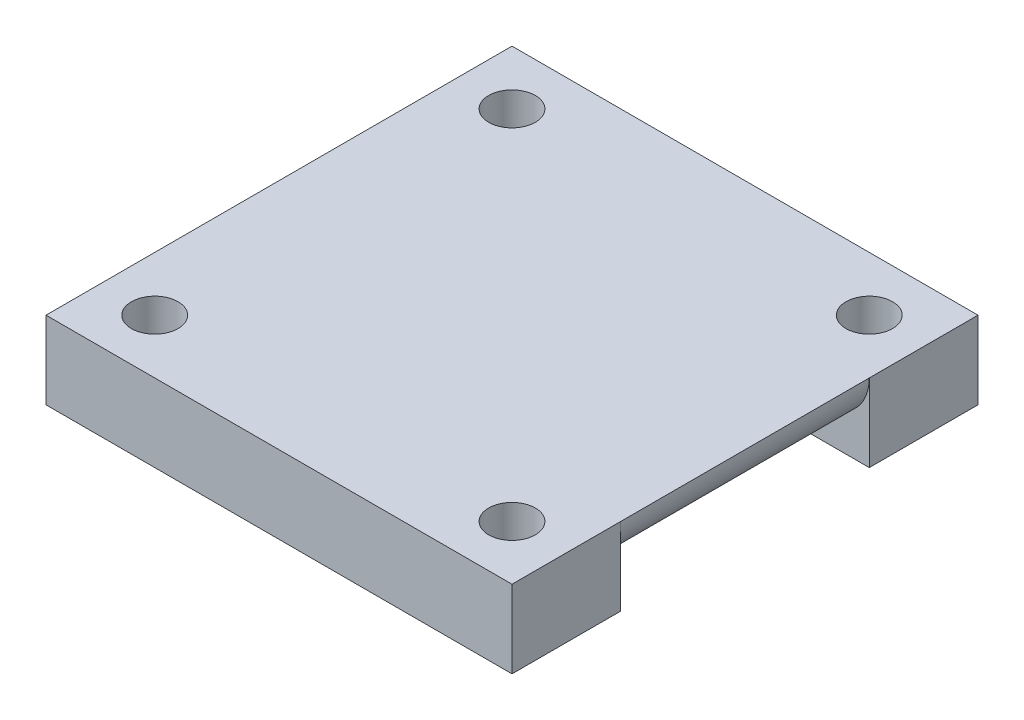
ISO-10303-21;
HEADER;
FILE_DESCRIPTION(('STEP AP214'),'2;1');
FILE_NAME('part.step','',(''),(''),'','','');
FILE_SCHEMA(('AUTOMOTIVE_DESIGN { 1 0 10303 214 1 1 1 1 }'));
ENDSEC;
DATA;
#1=APPLICATION_CONTEXT('core data for automotive mechanical design processes');
#2=APPLICATION_PROTOCOL_DEFINITION('international standard','automotive_design',2000,#1);
#3=PRODUCT_CONTEXT('',#1,'mechanical');
#4=PRODUCT('Part','Part','',(#3));
#5=PRODUCT_RELATED_PRODUCT_CATEGORY('part','',(#4));
#6=PRODUCT_DEFINITION_FORMATION('','',#4);
#7=PRODUCT_DEFINITION_CONTEXT('part definition',#1,'design');
#8=PRODUCT_DEFINITION('design','',#6,#7);
#9=PRODUCT_DEFINITION_SHAPE('','',#8);
#10=(LENGTH_UNIT() NAMED_UNIT(*) SI_UNIT(.MILLI.,.METRE.));
#11=(NAMED_UNIT(*) PLANE_ANGLE_UNIT() SI_UNIT($,.RADIAN.));
#12=(NAMED_UNIT(*) SI_UNIT($,.STERADIAN.) SOLID_ANGLE_UNIT());
#13=UNCERTAINTY_MEASURE_WITH_UNIT(LENGTH_MEASURE(1.E-05),#10,'distance_accuracy_value','');
#14=(GEOMETRIC_REPRESENTATION_CONTEXT(3) GLOBAL_UNCERTAINTY_ASSIGNED_CONTEXT((#13)) GLOBAL_UNIT_ASSIGNED_CONTEXT((#10,
#11,#12)) REPRESENTATION_CONTEXT('',''));
#15=CARTESIAN_POINT('',(0.,0.,0.));
#16=DIRECTION('',(0.,0.,1.));
#17=DIRECTION('',(1.,0.,0.));
#18=AXIS2_PLACEMENT_3D('',#15,#16,#17);
#19=CARTESIAN_POINT('',(15.,5.,0.));
#20=DIRECTION('',(1.,0.,0.));
#21=DIRECTION('',(0.,0.,-1.));
#22=AXIS2_PLACEMENT_3D('',#19,#20,#21);
#23=PLANE('',#22);
#24=DIRECTION('',(0.,-1.,0.));
#25=VECTOR('',#24,1.);
#26=CARTESIAN_POINT('',(15.,2.,8.));
#27=LINE('',#26,#25);
#28=CARTESIAN_POINT('',(15.,5.,8.));
#29=VERTEX_POINT('',#28);
#30=CARTESIAN_POINT('',(15.,0.,8.));
#31=VERTEX_POINT('',#30);
#32=EDGE_CURVE('E62',#29,#31,#27,.T.);
#33=ORIENTED_EDGE('',*,*,#32,.F.);
#34=DIRECTION('',(0.,0.,1.));
#35=VECTOR('',#34,1.);
#36=CARTESIAN_POINT('',(15.,5.,0.));
#37=LINE('',#36,#35);
#38=CARTESIAN_POINT('',(15.,5.,15.));
#39=VERTEX_POINT('',#38);
#40=EDGE_CURVE('E218',#29,#39,#37,.T.);
#41=ORIENTED_EDGE('',*,*,#40,.T.);
#42=DIRECTION('',(0.,-1.,0.));
#43=VECTOR('',#42,1.);
#44=CARTESIAN_POINT('',(15.,5.,15.));
#45=LINE('',#44,#43);
#46=CARTESIAN_POINT('',(15.,0.,15.));
#47=VERTEX_POINT('',#46);
#48=EDGE_CURVE('E188',#39,#47,#45,.T.);
#49=ORIENTED_EDGE('',*,*,#48,.T.);
#50=DIRECTION('',(0.,0.,1.));
#51=VECTOR('',#50,1.);
#52=CARTESIAN_POINT('',(15.,0.,0.));
#53=LINE('',#52,#51);
#54=EDGE_CURVE('E157',#31,#47,#53,.T.);
#55=ORIENTED_EDGE('',*,*,#54,.F.);
#56=EDGE_LOOP('',(#33,#41,#49,#55));
#57=FACE_BOUND('',#56,.T.);
#58=ADVANCED_FACE('F46',(#57),#23,.T.);
#59=CARTESIAN_POINT('',(-15.,5.,0.));
#60=DIRECTION('',(1.,0.,0.));
#61=DIRECTION('',(0.,0.,-1.));
#62=AXIS2_PLACEMENT_3D('',#59,#60,#61);
#63=PLANE('',#62);
#64=DIRECTION('',(0.,0.,1.));
#65=VECTOR('',#64,1.);
#66=CARTESIAN_POINT('',(-15.,5.,0.));
#67=LINE('',#66,#65);
#68=CARTESIAN_POINT('',(-15.,5.,8.));
#69=VERTEX_POINT('',#68);
#70=CARTESIAN_POINT('',(-15.,5.,15.));
#71=VERTEX_POINT('',#70);
#72=EDGE_CURVE('E138',#69,#71,#67,.T.);
#73=ORIENTED_EDGE('',*,*,#72,.F.);
#74=DIRECTION('',(0.,-1.,0.));
#75=VECTOR('',#74,1.);
#76=CARTESIAN_POINT('',(-15.,2.,8.));
#77=LINE('',#76,#75);
#78=CARTESIAN_POINT('',(-15.,0.,8.));
#79=VERTEX_POINT('',#78);
#80=EDGE_CURVE('E125',#69,#79,#77,.T.);
#81=ORIENTED_EDGE('',*,*,#80,.T.);
#82=DIRECTION('',(0.,0.,1.));
#83=VECTOR('',#82,1.);
#84=CARTESIAN_POINT('',(-15.,0.,0.));
#85=LINE('',#84,#83);
#86=CARTESIAN_POINT('',(-15.,0.,15.));
#87=VERTEX_POINT('',#86);
#88=EDGE_CURVE('E136',#79,#87,#85,.T.);
#89=ORIENTED_EDGE('',*,*,#88,.T.);
#90=DIRECTION('',(0.,-1.,0.));
#91=VECTOR('',#90,1.);
#92=CARTESIAN_POINT('',(-15.,5.,15.));
#93=LINE('',#92,#91);
#94=EDGE_CURVE('E192',#71,#87,#93,.T.);
#95=ORIENTED_EDGE('',*,*,#94,.F.);
#96=EDGE_LOOP('',(#73,#81,#89,#95));
#97=FACE_BOUND('',#96,.T.);
#98=ADVANCED_FACE('F134',(#97),#63,.F.);
#99=DIRECTION('',(0.,-1.,0.));
#100=VECTOR('',#99,1.);
#101=CARTESIAN_POINT('',(-15.,2.,-8.));
#102=LINE('',#101,#100);
#103=CARTESIAN_POINT('',(-15.,5.,-8.));
#104=VERTEX_POINT('',#103);
#105=CARTESIAN_POINT('',(-15.,0.,-8.));
#106=VERTEX_POINT('',#105);
#107=EDGE_CURVE('E309',#104,#106,#102,.T.);
#108=ORIENTED_EDGE('',*,*,#107,.F.);
#109=CARTESIAN_POINT('',(-15.,5.,-15.));
#110=VERTEX_POINT('',#109);
#111=EDGE_CURVE('E315',#110,#104,#67,.T.);
#112=ORIENTED_EDGE('',*,*,#111,.F.);
#113=DIRECTION('',(0.,-1.,0.));
#114=VECTOR('',#113,1.);
#115=CARTESIAN_POINT('',(-15.,5.,-15.));
#116=LINE('',#115,#114);
#117=CARTESIAN_POINT('',(-15.,0.,-15.));
#118=VERTEX_POINT('',#117);
#119=EDGE_CURVE('E182',#110,#118,#116,.T.);
#120=ORIENTED_EDGE('',*,*,#119,.T.);
#121=EDGE_CURVE('E147',#118,#106,#85,.T.);
#122=ORIENTED_EDGE('',*,*,#121,.T.);
#123=EDGE_LOOP('',(#108,#112,#120,#122));
#124=FACE_BOUND('',#123,.T.);
#125=ADVANCED_FACE('F278',(#124),#63,.F.);
#126=CARTESIAN_POINT('',(15.,5.,-15.));
#127=VERTEX_POINT('',#126);
#128=CARTESIAN_POINT('',(15.,5.,-8.));
#129=VERTEX_POINT('',#128);
#130=EDGE_CURVE('E230',#127,#129,#37,.T.);
#131=ORIENTED_EDGE('',*,*,#130,.T.);
#132=DIRECTION('',(0.,-1.,0.));
#133=VECTOR('',#132,1.);
#134=CARTESIAN_POINT('',(15.,2.,-8.));
#135=LINE('',#134,#133);
#136=CARTESIAN_POINT('',(15.,0.,-8.));
#137=VERTEX_POINT('',#136);
#138=EDGE_CURVE('E69',#129,#137,#135,.T.);
#139=ORIENTED_EDGE('',*,*,#138,.T.);
#140=CARTESIAN_POINT('',(15.,0.,-15.));
#141=VERTEX_POINT('',#140);
#142=EDGE_CURVE('E158',#141,#137,#53,.T.);
#143=ORIENTED_EDGE('',*,*,#142,.F.);
#144=DIRECTION('',(0.,-1.,0.));
#145=VECTOR('',#144,1.);
#146=CARTESIAN_POINT('',(15.,5.,-15.));
#147=LINE('',#146,#145);
#148=EDGE_CURVE('E185',#127,#141,#147,.T.);
#149=ORIENTED_EDGE('',*,*,#148,.F.);
#150=EDGE_LOOP('',(#131,#139,#143,#149));
#151=FACE_BOUND('',#150,.T.);
#152=ADVANCED_FACE('F267',(#151),#23,.T.);
#153=CARTESIAN_POINT('',(0.,0.,0.));
#154=DIRECTION('',(0.,1.,0.));
#155=DIRECTION('',(0.,0.,1.));
#156=AXIS2_PLACEMENT_3D('',#153,#154,#155);
#157=PLANE('',#156);
#158=CARTESIAN_POINT('',(-11.5,0.,11.5));
#159=DIRECTION('',(0.,1.,0.));
#160=DIRECTION('',(0.,0.,1.));
#161=AXIS2_PLACEMENT_3D('',#158,#159,#160);
#162=CIRCLE('',#161,1.5);
#163=CARTESIAN_POINT('',(-11.5,0.,13.));
#164=VERTEX_POINT('',#163);
#165=EDGE_CURVE('E174',#164,#164,#162,.T.);
#166=ORIENTED_EDGE('',*,*,#165,.T.);
#167=EDGE_LOOP('',(#166));
#168=FACE_BOUND('',#167,.T.);
#169=CARTESIAN_POINT('',(11.5,0.,11.5));
#170=DIRECTION('',(0.,1.,0.));
#171=DIRECTION('',(0.,0.,1.));
#172=AXIS2_PLACEMENT_3D('',#169,#170,#171);
#173=CIRCLE('',#172,1.5);
#174=CARTESIAN_POINT('',(11.5,0.,13.));
#175=VERTEX_POINT('',#174);
#176=EDGE_CURVE('E178',#175,#175,#173,.F.);
#177=ORIENTED_EDGE('',*,*,#176,.F.);
#178=EDGE_LOOP('',(#177));
#179=FACE_BOUND('',#178,.T.);
#180=DIRECTION('',(1.,0.,0.));
#181=VECTOR('',#180,1.);
#182=CARTESIAN_POINT('',(0.,0.,8.));
#183=LINE('',#182,#181);
#184=EDGE_CURVE('E122',#79,#31,#183,.T.);
#185=ORIENTED_EDGE('',*,*,#184,.T.);
#186=ORIENTED_EDGE('',*,*,#54,.T.);
#187=DIRECTION('',(1.,0.,0.));
#188=VECTOR('',#187,1.);
#189=CARTESIAN_POINT('',(0.,0.,15.));
#190=LINE('',#189,#188);
#191=EDGE_CURVE('E144',#87,#47,#190,.T.);
#192=ORIENTED_EDGE('',*,*,#191,.F.);
#193=ORIENTED_EDGE('',*,*,#88,.F.);
#194=EDGE_LOOP('',(#185,#186,#192,#193));
#195=FACE_BOUND('',#194,.T.);
#196=ADVANCED_FACE('F142',(#168,#179,#195),#157,.F.);
#197=CARTESIAN_POINT('',(0.,5.,15.));
#198=DIRECTION('',(0.,0.,-1.));
#199=DIRECTION('',(-1.,0.,0.));
#200=AXIS2_PLACEMENT_3D('',#197,#198,#199);
#201=PLANE('',#200);
#202=ORIENTED_EDGE('',*,*,#191,.T.);
#203=ORIENTED_EDGE('',*,*,#48,.F.);
#204=DIRECTION('',(1.,0.,0.));
#205=VECTOR('',#204,1.);
#206=CARTESIAN_POINT('',(0.,5.,15.));
#207=LINE('',#206,#205);
#208=EDGE_CURVE('E226',#71,#39,#207,.T.);
#209=ORIENTED_EDGE('',*,*,#208,.F.);
#210=ORIENTED_EDGE('',*,*,#94,.T.);
#211=EDGE_LOOP('',(#202,#203,#209,#210));
#212=FACE_BOUND('',#211,.T.);
#213=ADVANCED_FACE('F266',(#212),#201,.F.);
#214=CARTESIAN_POINT('',(-11.5,5.,11.5));
#215=DIRECTION('',(0.,-1.,0.));
#216=DIRECTION('',(0.,0.,-1.));
#217=AXIS2_PLACEMENT_3D('',#214,#215,#216);
#218=CYLINDRICAL_SURFACE('',#217,1.5);
#219=CARTESIAN_POINT('',(-11.5,5.,11.5));
#220=DIRECTION('',(0.,1.,0.));
#221=DIRECTION('',(0.,0.,1.));
#222=AXIS2_PLACEMENT_3D('',#219,#220,#221);
#223=CIRCLE('',#222,1.5);
#224=CARTESIAN_POINT('',(-11.5,5.,13.));
#225=VERTEX_POINT('',#224);
#226=EDGE_CURVE('E248',#225,#225,#223,.T.);
#227=ORIENTED_EDGE('',*,*,#226,.T.);
#228=EDGE_LOOP('',(#227));
#229=FACE_BOUND('',#228,.T.);
#230=ORIENTED_EDGE('',*,*,#165,.F.);
#231=EDGE_LOOP('',(#230));
#232=FACE_BOUND('',#231,.T.);
#233=ADVANCED_FACE('F275',(#229,#232),#218,.F.);
#234=CARTESIAN_POINT('',(-11.5,5.,-11.5));
#235=DIRECTION('',(0.,-1.,0.));
#236=DIRECTION('',(0.,0.,-1.));
#237=AXIS2_PLACEMENT_3D('',#234,#235,#236);
#238=CYLINDRICAL_SURFACE('',#237,1.5);
#239=CARTESIAN_POINT('',(-11.5,5.,-11.5));
#240=DIRECTION('',(0.,1.,0.));
#241=DIRECTION('',(0.,0.,1.));
#242=AXIS2_PLACEMENT_3D('',#239,#240,#241);
#243=CIRCLE('',#242,1.5);
#244=CARTESIAN_POINT('',(-11.5,5.,-9.99999999999999));
#245=VERTEX_POINT('',#244);
#246=EDGE_CURVE('E245',#245,#245,#243,.F.);
#247=ORIENTED_EDGE('',*,*,#246,.F.);
#248=EDGE_LOOP('',(#247));
#249=FACE_BOUND('',#248,.T.);
#250=CARTESIAN_POINT('',(-11.5,0.,-11.5));
#251=DIRECTION('',(0.,1.,0.));
#252=DIRECTION('',(0.,0.,1.));
#253=AXIS2_PLACEMENT_3D('',#250,#251,#252);
#254=CIRCLE('',#253,1.5);
#255=CARTESIAN_POINT('',(-11.5,0.,-9.99999999999999));
#256=VERTEX_POINT('',#255);
#257=EDGE_CURVE('E170',#256,#256,#254,.F.);
#258=ORIENTED_EDGE('',*,*,#257,.T.);
#259=EDGE_LOOP('',(#258));
#260=FACE_BOUND('',#259,.T.);
#261=ADVANCED_FACE('F343',(#249,#260),#238,.F.);
#262=CARTESIAN_POINT('',(11.5,5.,-11.5));
#263=DIRECTION('',(0.,-1.,0.));
#264=DIRECTION('',(0.,0.,-1.));
#265=AXIS2_PLACEMENT_3D('',#262,#263,#264);
#266=CYLINDRICAL_SURFACE('',#265,1.5);
#267=CARTESIAN_POINT('',(11.5,5.,-11.5));
#268=DIRECTION('',(0.,1.,0.));
#269=DIRECTION('',(0.,0.,1.));
#270=AXIS2_PLACEMENT_3D('',#267,#268,#269);
#271=CIRCLE('',#270,1.5);
#272=CARTESIAN_POINT('',(11.5,5.,-9.99999999999999));
#273=VERTEX_POINT('',#272);
#274=EDGE_CURVE('E241',#273,#273,#271,.T.);
#275=ORIENTED_EDGE('',*,*,#274,.T.);
#276=EDGE_LOOP('',(#275));
#277=FACE_BOUND('',#276,.T.);
#278=CARTESIAN_POINT('',(11.5,0.,-11.5));
#279=DIRECTION('',(0.,1.,0.));
#280=DIRECTION('',(0.,0.,1.));
#281=AXIS2_PLACEMENT_3D('',#278,#279,#280);
#282=CIRCLE('',#281,1.5);
#283=CARTESIAN_POINT('',(11.5,0.,-9.99999999999999));
#284=VERTEX_POINT('',#283);
#285=EDGE_CURVE('E166',#284,#284,#282,.T.);
#286=ORIENTED_EDGE('',*,*,#285,.F.);
#287=EDGE_LOOP('',(#286));
#288=FACE_BOUND('',#287,.T.);
#289=ADVANCED_FACE('F339',(#277,#288),#266,.F.);
#290=CARTESIAN_POINT('',(0.,5.,-15.));
#291=DIRECTION('',(0.,0.,-1.));
#292=DIRECTION('',(-1.,0.,0.));
#293=AXIS2_PLACEMENT_3D('',#290,#291,#292);
#294=PLANE('',#293);
#295=DIRECTION('',(1.,0.,0.));
#296=VECTOR('',#295,1.);
#297=CARTESIAN_POINT('',(0.,0.,-15.));
#298=LINE('',#297,#296);
#299=EDGE_CURVE('E162',#118,#141,#298,.T.);
#300=ORIENTED_EDGE('',*,*,#299,.F.);
#301=ORIENTED_EDGE('',*,*,#119,.F.);
#302=DIRECTION('',(1.,0.,0.));
#303=VECTOR('',#302,1.);
#304=CARTESIAN_POINT('',(0.,5.,-15.));
#305=LINE('',#304,#303);
#306=EDGE_CURVE('E234',#110,#127,#305,.T.);
#307=ORIENTED_EDGE('',*,*,#306,.T.);
#308=ORIENTED_EDGE('',*,*,#148,.T.);
#309=EDGE_LOOP('',(#300,#301,#307,#308));
#310=FACE_BOUND('',#309,.T.);
#311=ADVANCED_FACE('F261',(#310),#294,.T.);
#312=CARTESIAN_POINT('',(11.5,5.,11.5));
#313=DIRECTION('',(0.,-1.,0.));
#314=DIRECTION('',(0.,0.,-1.));
#315=AXIS2_PLACEMENT_3D('',#312,#313,#314);
#316=CYLINDRICAL_SURFACE('',#315,1.5);
#317=CARTESIAN_POINT('',(11.5,5.,11.5));
#318=DIRECTION('',(0.,1.,0.));
#319=DIRECTION('',(0.,0.,1.));
#320=AXIS2_PLACEMENT_3D('',#317,#318,#319);
#321=CIRCLE('',#320,1.5);
#322=CARTESIAN_POINT('',(11.5,5.,13.));
#323=VERTEX_POINT('',#322);
#324=EDGE_CURVE('E153',#323,#323,#321,.F.);
#325=ORIENTED_EDGE('',*,*,#324,.F.);
#326=EDGE_LOOP('',(#325));
#327=FACE_BOUND('',#326,.T.);
#328=ORIENTED_EDGE('',*,*,#176,.T.);
#329=EDGE_LOOP('',(#328));
#330=FACE_BOUND('',#329,.T.);
#331=ADVANCED_FACE('F258',(#327,#330),#316,.F.);
#332=CARTESIAN_POINT('',(0.,5.,0.));
#333=DIRECTION('',(0.,1.,0.));
#334=DIRECTION('',(0.,0.,1.));
#335=AXIS2_PLACEMENT_3D('',#332,#333,#334);
#336=PLANE('',#335);
#337=ORIENTED_EDGE('',*,*,#111,.T.);
#338=EDGE_CURVE('E307',#104,#69,#67,.T.);
#339=ORIENTED_EDGE('',*,*,#338,.T.);
#340=ORIENTED_EDGE('',*,*,#72,.T.);
#341=ORIENTED_EDGE('',*,*,#208,.T.);
#342=ORIENTED_EDGE('',*,*,#40,.F.);
#343=EDGE_CURVE('E223',#129,#29,#37,.T.);
#344=ORIENTED_EDGE('',*,*,#343,.F.);
#345=ORIENTED_EDGE('',*,*,#130,.F.);
#346=ORIENTED_EDGE('',*,*,#306,.F.);
#347=EDGE_LOOP('',(#337,#339,#340,#341,#342,#344,#345,#346));
#348=FACE_BOUND('',#347,.T.);
#349=ORIENTED_EDGE('',*,*,#274,.F.);
#350=EDGE_LOOP('',(#349));
#351=FACE_BOUND('',#350,.T.);
#352=ORIENTED_EDGE('',*,*,#246,.T.);
#353=EDGE_LOOP('',(#352));
#354=FACE_BOUND('',#353,.T.);
#355=ORIENTED_EDGE('',*,*,#226,.F.);
#356=EDGE_LOOP('',(#355));
#357=FACE_BOUND('',#356,.T.);
#358=ORIENTED_EDGE('',*,*,#324,.T.);
#359=EDGE_LOOP('',(#358));
#360=FACE_BOUND('',#359,.T.);
#361=ADVANCED_FACE('F220',(#348,#351,#354,#357,#360),#336,.T.);
#362=ORIENTED_EDGE('',*,*,#142,.T.);
#363=DIRECTION('',(1.,0.,0.));
#364=VECTOR('',#363,1.);
#365=CARTESIAN_POINT('',(0.,0.,-8.));
#366=LINE('',#365,#364);
#367=EDGE_CURVE('E130',#106,#137,#366,.T.);
#368=ORIENTED_EDGE('',*,*,#367,.F.);
#369=ORIENTED_EDGE('',*,*,#121,.F.);
#370=ORIENTED_EDGE('',*,*,#299,.T.);
#371=EDGE_LOOP('',(#362,#368,#369,#370));
#372=FACE_BOUND('',#371,.T.);
#373=ORIENTED_EDGE('',*,*,#285,.T.);
#374=EDGE_LOOP('',(#373));
#375=FACE_BOUND('',#374,.T.);
#376=ORIENTED_EDGE('',*,*,#257,.F.);
#377=EDGE_LOOP('',(#376));
#378=FACE_BOUND('',#377,.T.);
#379=ADVANCED_FACE('F270',(#372,#375,#378),#157,.F.);
#380=CARTESIAN_POINT('',(0.,2.,8.));
#381=DIRECTION('',(0.,0.,-1.));
#382=DIRECTION('',(-1.,0.,0.));
#383=AXIS2_PLACEMENT_3D('',#380,#381,#382);
#384=PLANE('',#383);
#385=ORIENTED_EDGE('',*,*,#184,.F.);
#386=ORIENTED_EDGE('',*,*,#80,.F.);
#387=CARTESIAN_POINT('',(-12.,5.,8.));
#388=DIRECTION('',(0.,0.,-1.));
#389=DIRECTION('',(-1.,0.,0.));
#390=AXIS2_PLACEMENT_3D('',#387,#388,#389);
#391=CIRCLE('',#390,3.);
#392=CARTESIAN_POINT('',(-12.,2.,8.));
#393=VERTEX_POINT('',#392);
#394=EDGE_CURVE('E202',#69,#393,#391,.F.);
#395=ORIENTED_EDGE('',*,*,#394,.T.);
#396=DIRECTION('',(1.,0.,0.));
#397=VECTOR('',#396,1.);
#398=CARTESIAN_POINT('',(0.,2.,8.));
#399=LINE('',#398,#397);
#400=CARTESIAN_POINT('',(12.,2.,8.));
#401=VERTEX_POINT('',#400);
#402=EDGE_CURVE('E212',#393,#401,#399,.T.);
#403=ORIENTED_EDGE('',*,*,#402,.T.);
#404=CARTESIAN_POINT('',(12.,5.,8.));
#405=DIRECTION('',(0.,0.,-1.));
#406=DIRECTION('',(-1.,0.,0.));
#407=AXIS2_PLACEMENT_3D('',#404,#405,#406);
#408=CIRCLE('',#407,3.);
#409=EDGE_CURVE('E55',#401,#29,#408,.F.);
#410=ORIENTED_EDGE('',*,*,#409,.T.);
#411=ORIENTED_EDGE('',*,*,#32,.T.);
#412=EDGE_LOOP('',(#385,#386,#395,#403,#410,#411));
#413=FACE_BOUND('',#412,.T.);
#414=ADVANCED_FACE('F124',(#413),#384,.T.);
#415=CARTESIAN_POINT('',(0.,2.,-8.));
#416=DIRECTION('',(0.,0.,-1.));
#417=DIRECTION('',(-1.,0.,0.));
#418=AXIS2_PLACEMENT_3D('',#415,#416,#417);
#419=PLANE('',#418);
#420=ORIENTED_EDGE('',*,*,#367,.T.);
#421=ORIENTED_EDGE('',*,*,#138,.F.);
#422=CARTESIAN_POINT('',(12.,5.,-8.));
#423=DIRECTION('',(0.,0.,-1.));
#424=DIRECTION('',(-1.,0.,0.));
#425=AXIS2_PLACEMENT_3D('',#422,#423,#424);
#426=CIRCLE('',#425,3.);
#427=CARTESIAN_POINT('',(12.,2.,-8.));
#428=VERTEX_POINT('',#427);
#429=EDGE_CURVE('E11',#129,#428,#426,.T.);
#430=ORIENTED_EDGE('',*,*,#429,.T.);
#431=DIRECTION('',(1.,0.,0.));
#432=VECTOR('',#431,1.);
#433=CARTESIAN_POINT('',(0.,2.,-8.));
#434=LINE('',#433,#432);
#435=CARTESIAN_POINT('',(-12.,2.,-8.));
#436=VERTEX_POINT('',#435);
#437=EDGE_CURVE('E312',#436,#428,#434,.T.);
#438=ORIENTED_EDGE('',*,*,#437,.F.);
#439=CARTESIAN_POINT('',(-12.,5.,-8.));
#440=DIRECTION('',(0.,0.,-1.));
#441=DIRECTION('',(-1.,0.,0.));
#442=AXIS2_PLACEMENT_3D('',#439,#440,#441);
#443=CIRCLE('',#442,3.);
#444=EDGE_CURVE('E205',#436,#104,#443,.T.);
#445=ORIENTED_EDGE('',*,*,#444,.T.);
#446=ORIENTED_EDGE('',*,*,#107,.T.);
#447=EDGE_LOOP('',(#420,#421,#430,#438,#445,#446));
#448=FACE_BOUND('',#447,.T.);
#449=ADVANCED_FACE('F301',(#448),#419,.F.);
#450=CARTESIAN_POINT('',(0.,2.,0.));
#451=DIRECTION('',(0.,1.,0.));
#452=DIRECTION('',(0.,0.,1.));
#453=AXIS2_PLACEMENT_3D('',#450,#451,#452);
#454=PLANE('',#453);
#455=ORIENTED_EDGE('',*,*,#402,.F.);
#456=DIRECTION('',(0.,0.,1.));
#457=VECTOR('',#456,1.);
#458=CARTESIAN_POINT('',(-12.,2.,0.));
#459=LINE('',#458,#457);
#460=EDGE_CURVE('E199',#393,#436,#459,.F.);
#461=ORIENTED_EDGE('',*,*,#460,.T.);
#462=ORIENTED_EDGE('',*,*,#437,.T.);
#463=DIRECTION('',(0.,0.,1.));
#464=VECTOR('',#463,1.);
#465=CARTESIAN_POINT('',(12.,2.,8.));
#466=LINE('',#465,#464);
#467=EDGE_CURVE('E195',#428,#401,#466,.T.);
#468=ORIENTED_EDGE('',*,*,#467,.T.);
#469=EDGE_LOOP('',(#455,#461,#462,#468));
#470=FACE_BOUND('',#469,.T.);
#471=ADVANCED_FACE('F295',(#470),#454,.F.);
#472=CARTESIAN_POINT('',(-12.,5.,0.));
#473=DIRECTION('',(0.,0.,1.));
#474=DIRECTION('',(1.,0.,0.));
#475=AXIS2_PLACEMENT_3D('',#472,#473,#474);
#476=CYLINDRICAL_SURFACE('',#475,3.);
#477=ORIENTED_EDGE('',*,*,#444,.F.);
#478=ORIENTED_EDGE('',*,*,#460,.F.);
#479=ORIENTED_EDGE('',*,*,#394,.F.);
#480=ORIENTED_EDGE('',*,*,#338,.F.);
#481=EDGE_LOOP('',(#477,#478,#479,#480));
#482=FACE_BOUND('',#481,.T.);
#483=ADVANCED_FACE('F293',(#482),#476,.T.);
#484=CARTESIAN_POINT('',(12.,5.,0.));
#485=DIRECTION('',(0.,0.,-1.));
#486=DIRECTION('',(-1.,0.,0.));
#487=AXIS2_PLACEMENT_3D('',#484,#485,#486);
#488=CYLINDRICAL_SURFACE('',#487,3.);
#489=ORIENTED_EDGE('',*,*,#429,.F.);
#490=ORIENTED_EDGE('',*,*,#343,.T.);
#491=ORIENTED_EDGE('',*,*,#409,.F.);
#492=ORIENTED_EDGE('',*,*,#467,.F.);
#493=EDGE_LOOP('',(#489,#490,#491,#492));
#494=FACE_BOUND('',#493,.T.);
#495=ADVANCED_FACE('F48',(#494),#488,.T.);
#496=CLOSED_SHELL('',(#58,#98,#125,#152,#196,#213,#233,#261,#289,#311,#331,#361,#379,#414,#449,
#471,#483,#495));
#497=MANIFOLD_SOLID_BREP('B2',#496);
#498=ADVANCED_BREP_SHAPE_REPRESENTATION('',(#18,#497),#14);
#499=SHAPE_DEFINITION_REPRESENTATION(#9,#498);
ENDSEC;
END-ISO-10303-21;
